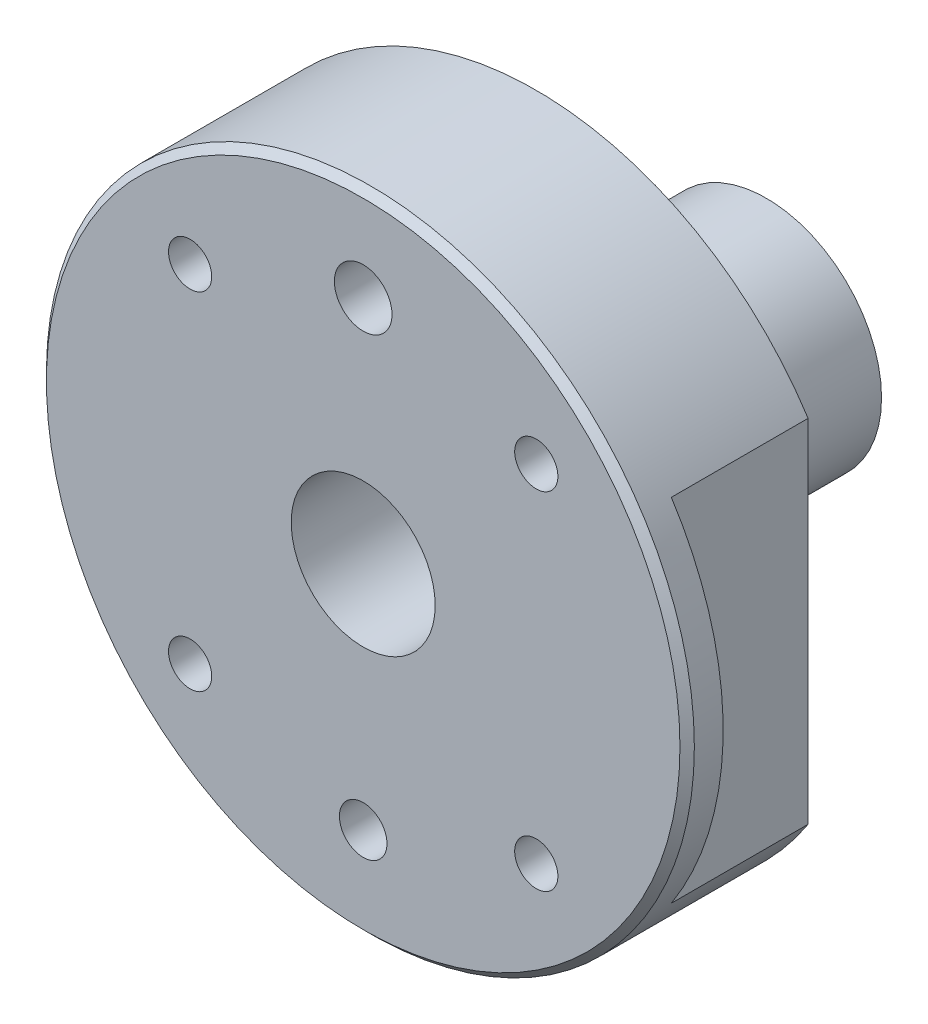
ISO-10303-21;
HEADER;
FILE_DESCRIPTION(('STEP AP214'),'2;1');
FILE_NAME('part.step','',(''),(''),'','','');
FILE_SCHEMA(('AUTOMOTIVE_DESIGN { 1 0 10303 214 1 1 1 1 }'));
ENDSEC;
DATA;
#1=APPLICATION_CONTEXT('core data for automotive mechanical design processes');
#2=APPLICATION_PROTOCOL_DEFINITION('international standard','automotive_design',2000,#1);
#3=PRODUCT_CONTEXT('',#1,'mechanical');
#4=PRODUCT('Part','Part','',(#3));
#5=PRODUCT_RELATED_PRODUCT_CATEGORY('part','',(#4));
#6=PRODUCT_DEFINITION_FORMATION('','',#4);
#7=PRODUCT_DEFINITION_CONTEXT('part definition',#1,'design');
#8=PRODUCT_DEFINITION('design','',#6,#7);
#9=PRODUCT_DEFINITION_SHAPE('','',#8);
#10=(LENGTH_UNIT() NAMED_UNIT(*) SI_UNIT(.MILLI.,.METRE.));
#11=(NAMED_UNIT(*) PLANE_ANGLE_UNIT() SI_UNIT($,.RADIAN.));
#12=(NAMED_UNIT(*) SI_UNIT($,.STERADIAN.) SOLID_ANGLE_UNIT());
#13=UNCERTAINTY_MEASURE_WITH_UNIT(LENGTH_MEASURE(1.E-05),#10,'distance_accuracy_value','');
#14=(GEOMETRIC_REPRESENTATION_CONTEXT(3) GLOBAL_UNCERTAINTY_ASSIGNED_CONTEXT((#13)) GLOBAL_UNIT_ASSIGNED_CONTEXT((#10,
#11,#12)) REPRESENTATION_CONTEXT('',''));
#15=CARTESIAN_POINT('',(0.,0.,0.));
#16=DIRECTION('',(0.,0.,1.));
#17=DIRECTION('',(1.,0.,0.));
#18=AXIS2_PLACEMENT_3D('',#15,#16,#17);
#19=CARTESIAN_POINT('',(0.,0.,0.));
#20=DIRECTION('',(0.,0.,1.));
#21=DIRECTION('',(1.,0.,0.));
#22=AXIS2_PLACEMENT_3D('',#19,#20,#21);
#23=PLANE('',#22);
#24=CARTESIAN_POINT('',(0.,16.,0.));
#25=DIRECTION('',(0.,0.,-1.));
#26=DIRECTION('',(-1.,0.,0.));
#27=AXIS2_PLACEMENT_3D('',#24,#25,#26);
#28=CIRCLE('',#27,2.);
#29=CARTESIAN_POINT('',(-2.,16.,0.));
#30=VERTEX_POINT('',#29);
#31=EDGE_CURVE('E126',#30,#30,#28,.T.);
#32=ORIENTED_EDGE('',*,*,#31,.F.);
#33=EDGE_LOOP('',(#32));
#34=FACE_BOUND('',#33,.T.);
#35=CARTESIAN_POINT('',(0.,-16.,0.));
#36=DIRECTION('',(0.,0.,-1.));
#37=DIRECTION('',(-1.,0.,0.));
#38=AXIS2_PLACEMENT_3D('',#35,#36,#37);
#39=CIRCLE('',#38,1.65);
#40=CARTESIAN_POINT('',(-1.65,-16.,0.));
#41=VERTEX_POINT('',#40);
#42=EDGE_CURVE('E132',#41,#41,#39,.T.);
#43=ORIENTED_EDGE('',*,*,#42,.F.);
#44=EDGE_LOOP('',(#43));
#45=FACE_BOUND('',#44,.T.);
#46=CARTESIAN_POINT('',(0.,0.,0.));
#47=DIRECTION('',(0.,0.,1.));
#48=DIRECTION('',(1.,0.,0.));
#49=AXIS2_PLACEMENT_3D('',#46,#47,#48);
#50=CIRCLE('',#49,8.);
#51=CARTESIAN_POINT('',(8.,0.,0.));
#52=VERTEX_POINT('',#51);
#53=EDGE_CURVE('E12',#52,#52,#50,.F.);
#54=ORIENTED_EDGE('',*,*,#53,.F.);
#55=EDGE_LOOP('',(#54));
#56=FACE_BOUND('',#55,.T.);
#57=DIRECTION('',(0.,1.,0.));
#58=VECTOR('',#57,1.);
#59=CARTESIAN_POINT('',(-18.9,-25.,0.));
#60=LINE('',#59,#58);
#61=CARTESIAN_POINT('',(-18.9,-12.2081939696255,0.));
#62=VERTEX_POINT('',#61);
#63=CARTESIAN_POINT('',(-18.9,12.2081939696255,0.));
#64=VERTEX_POINT('',#63);
#65=EDGE_CURVE('E60',#62,#64,#60,.T.);
#66=ORIENTED_EDGE('',*,*,#65,.T.);
#67=CARTESIAN_POINT('',(0.,0.,0.));
#68=DIRECTION('',(0.,0.,1.));
#69=DIRECTION('',(1.,0.,0.));
#70=AXIS2_PLACEMENT_3D('',#67,#68,#69);
#71=CIRCLE('',#70,22.5);
#72=CARTESIAN_POINT('',(18.9,12.2081939696255,0.));
#73=VERTEX_POINT('',#72);
#74=EDGE_CURVE('E100',#73,#64,#71,.T.);
#75=ORIENTED_EDGE('',*,*,#74,.F.);
#76=DIRECTION('',(0.,-1.,0.));
#77=VECTOR('',#76,1.);
#78=CARTESIAN_POINT('',(18.9,-25.,0.));
#79=LINE('',#78,#77);
#80=CARTESIAN_POINT('',(18.9,-12.2081939696255,0.));
#81=VERTEX_POINT('',#80);
#82=EDGE_CURVE('E68',#73,#81,#79,.T.);
#83=ORIENTED_EDGE('',*,*,#82,.T.);
#84=EDGE_CURVE('E98',#62,#81,#71,.T.);
#85=ORIENTED_EDGE('',*,*,#84,.F.);
#86=EDGE_LOOP('',(#66,#75,#83,#85));
#87=FACE_BOUND('',#86,.T.);
#88=ADVANCED_FACE('F42',(#34,#45,#56,#87),#23,.F.);
#89=CARTESIAN_POINT('',(0.,0.,12.));
#90=DIRECTION('',(0.,0.,-1.));
#91=DIRECTION('',(-1.,0.,0.));
#92=AXIS2_PLACEMENT_3D('',#89,#90,#91);
#93=CYLINDRICAL_SURFACE('',#92,22.5);
#94=CARTESIAN_POINT('',(0.,0.,11.5));
#95=DIRECTION('',(0.,0.,1.));
#96=DIRECTION('',(1.,0.,0.));
#97=AXIS2_PLACEMENT_3D('',#94,#95,#96);
#98=CIRCLE('',#97,22.5);
#99=CARTESIAN_POINT('',(22.5,0.,11.5));
#100=VERTEX_POINT('',#99);
#101=EDGE_CURVE('E116',#100,#100,#98,.F.);
#102=ORIENTED_EDGE('',*,*,#101,.T.);
#103=EDGE_LOOP('',(#102));
#104=FACE_BOUND('',#103,.T.);
#105=DIRECTION('',(0.,0.,-1.));
#106=VECTOR('',#105,1.);
#107=CARTESIAN_POINT('',(-18.9,12.2081939696255,12.));
#108=LINE('',#107,#106);
#109=CARTESIAN_POINT('',(-18.9,12.2081939696255,9.5));
#110=VERTEX_POINT('',#109);
#111=EDGE_CURVE('E52',#110,#64,#108,.T.);
#112=ORIENTED_EDGE('',*,*,#111,.F.);
#113=CARTESIAN_POINT('',(0.,0.,9.5));
#114=DIRECTION('',(0.,0.,-1.));
#115=DIRECTION('',(-1.,0.,0.));
#116=AXIS2_PLACEMENT_3D('',#113,#114,#115);
#117=CIRCLE('',#116,22.5);
#118=CARTESIAN_POINT('',(-18.9,-12.2081939696255,9.5));
#119=VERTEX_POINT('',#118);
#120=EDGE_CURVE('E121',#119,#110,#117,.T.);
#121=ORIENTED_EDGE('',*,*,#120,.F.);
#122=DIRECTION('',(0.,0.,-1.));
#123=VECTOR('',#122,1.);
#124=CARTESIAN_POINT('',(-18.9,-12.2081939696255,12.));
#125=LINE('',#124,#123);
#126=EDGE_CURVE('E92',#62,#119,#125,.F.);
#127=ORIENTED_EDGE('',*,*,#126,.F.);
#128=ORIENTED_EDGE('',*,*,#84,.T.);
#129=DIRECTION('',(0.,0.,-1.));
#130=VECTOR('',#129,1.);
#131=CARTESIAN_POINT('',(18.9,-12.2081939696255,12.));
#132=LINE('',#131,#130);
#133=CARTESIAN_POINT('',(18.9,-12.2081939696255,9.5));
#134=VERTEX_POINT('',#133);
#135=EDGE_CURVE('E85',#134,#81,#132,.T.);
#136=ORIENTED_EDGE('',*,*,#135,.F.);
#137=CARTESIAN_POINT('',(18.9,12.2081939696255,9.5));
#138=VERTEX_POINT('',#137);
#139=EDGE_CURVE('E93',#138,#134,#117,.T.);
#140=ORIENTED_EDGE('',*,*,#139,.F.);
#141=DIRECTION('',(0.,0.,-1.));
#142=VECTOR('',#141,1.);
#143=CARTESIAN_POINT('',(18.9,12.2081939696255,12.));
#144=LINE('',#143,#142);
#145=EDGE_CURVE('E119',#73,#138,#144,.F.);
#146=ORIENTED_EDGE('',*,*,#145,.F.);
#147=ORIENTED_EDGE('',*,*,#74,.T.);
#148=EDGE_LOOP('',(#112,#121,#127,#128,#136,#140,#146,#147));
#149=FACE_BOUND('',#148,.T.);
#150=ADVANCED_FACE('F104',(#104,#149),#93,.T.);
#151=CARTESIAN_POINT('',(0.,0.,12.));
#152=DIRECTION('',(0.,0.,1.));
#153=DIRECTION('',(1.,0.,0.));
#154=AXIS2_PLACEMENT_3D('',#151,#152,#153);
#155=PLANE('',#154);
#156=CARTESIAN_POINT('',(0.,16.,12.));
#157=DIRECTION('',(0.,0.,1.));
#158=DIRECTION('',(1.,0.,0.));
#159=AXIS2_PLACEMENT_3D('',#156,#157,#158);
#160=CIRCLE('',#159,2.);
#161=CARTESIAN_POINT('',(2.,16.,12.));
#162=VERTEX_POINT('',#161);
#163=EDGE_CURVE('E47',#162,#162,#160,.T.);
#164=ORIENTED_EDGE('',*,*,#163,.F.);
#165=EDGE_LOOP('',(#164));
#166=FACE_BOUND('',#165,.T.);
#167=CARTESIAN_POINT('',(0.,-16.,12.));
#168=DIRECTION('',(0.,0.,1.));
#169=DIRECTION('',(1.,0.,0.));
#170=AXIS2_PLACEMENT_3D('',#167,#168,#169);
#171=CIRCLE('',#170,1.65);
#172=CARTESIAN_POINT('',(1.65,-16.,12.));
#173=VERTEX_POINT('',#172);
#174=EDGE_CURVE('E124',#173,#173,#171,.T.);
#175=ORIENTED_EDGE('',*,*,#174,.F.);
#176=EDGE_LOOP('',(#175));
#177=FACE_BOUND('',#176,.T.);
#178=CARTESIAN_POINT('',(0.,0.,12.));
#179=DIRECTION('',(0.,0.,1.));
#180=DIRECTION('',(1.,0.,0.));
#181=AXIS2_PLACEMENT_3D('',#178,#179,#180);
#182=CIRCLE('',#181,22.);
#183=CARTESIAN_POINT('',(22.,0.,12.));
#184=VERTEX_POINT('',#183);
#185=EDGE_CURVE('E108',#184,#184,#182,.T.);
#186=ORIENTED_EDGE('',*,*,#185,.T.);
#187=EDGE_LOOP('',(#186));
#188=FACE_BOUND('',#187,.T.);
#189=CARTESIAN_POINT('',(-12.0208152801713,12.0208152801713,12.));
#190=DIRECTION('',(0.,0.,1.));
#191=DIRECTION('',(1.,0.,0.));
#192=AXIS2_PLACEMENT_3D('',#189,#190,#191);
#193=CIRCLE('',#192,1.5);
#194=CARTESIAN_POINT('',(-10.5208152801713,12.0208152801713,12.));
#195=VERTEX_POINT('',#194);
#196=EDGE_CURVE('E158',#195,#195,#193,.T.);
#197=ORIENTED_EDGE('',*,*,#196,.F.);
#198=EDGE_LOOP('',(#197));
#199=FACE_BOUND('',#198,.T.);
#200=CARTESIAN_POINT('',(12.0208152801713,-12.0208152801713,12.));
#201=DIRECTION('',(0.,0.,1.));
#202=DIRECTION('',(1.,0.,0.));
#203=AXIS2_PLACEMENT_3D('',#200,#201,#202);
#204=CIRCLE('',#203,1.5);
#205=CARTESIAN_POINT('',(13.5208152801713,-12.0208152801713,12.));
#206=VERTEX_POINT('',#205);
#207=EDGE_CURVE('E165',#206,#206,#204,.T.);
#208=ORIENTED_EDGE('',*,*,#207,.F.);
#209=EDGE_LOOP('',(#208));
#210=FACE_BOUND('',#209,.T.);
#211=CARTESIAN_POINT('',(-12.0208152801713,-12.0208152801713,12.));
#212=DIRECTION('',(0.,0.,1.));
#213=DIRECTION('',(1.,0.,0.));
#214=AXIS2_PLACEMENT_3D('',#211,#212,#213);
#215=CIRCLE('',#214,1.5);
#216=CARTESIAN_POINT('',(-10.5208152801713,-12.0208152801713,12.));
#217=VERTEX_POINT('',#216);
#218=EDGE_CURVE('E152',#217,#217,#215,.T.);
#219=ORIENTED_EDGE('',*,*,#218,.F.);
#220=EDGE_LOOP('',(#219));
#221=FACE_BOUND('',#220,.T.);
#222=CARTESIAN_POINT('',(12.0208152801713,12.0208152801713,12.));
#223=DIRECTION('',(0.,0.,1.));
#224=DIRECTION('',(1.,0.,0.));
#225=AXIS2_PLACEMENT_3D('',#222,#223,#224);
#226=CIRCLE('',#225,1.5);
#227=CARTESIAN_POINT('',(13.5208152801713,12.0208152801713,12.));
#228=VERTEX_POINT('',#227);
#229=EDGE_CURVE('E161',#228,#228,#226,.T.);
#230=ORIENTED_EDGE('',*,*,#229,.F.);
#231=EDGE_LOOP('',(#230));
#232=FACE_BOUND('',#231,.T.);
#233=CARTESIAN_POINT('',(0.,0.,12.));
#234=DIRECTION('',(0.,0.,1.));
#235=DIRECTION('',(1.,0.,0.));
#236=AXIS2_PLACEMENT_3D('',#233,#234,#235);
#237=CIRCLE('',#236,5.);
#238=CARTESIAN_POINT('',(5.,0.,12.));
#239=VERTEX_POINT('',#238);
#240=EDGE_CURVE('E106',#239,#239,#237,.T.);
#241=ORIENTED_EDGE('',*,*,#240,.F.);
#242=EDGE_LOOP('',(#241));
#243=FACE_BOUND('',#242,.T.);
#244=ADVANCED_FACE('F178',(#166,#177,#188,#199,#210,#221,#232,#243),#155,.T.);
#245=CARTESIAN_POINT('',(0.,0.,12.));
#246=DIRECTION('',(0.,0.,-1.));
#247=DIRECTION('',(-1.,0.,0.));
#248=AXIS2_PLACEMENT_3D('',#245,#246,#247);
#249=CYLINDRICAL_SURFACE('',#248,5.);
#250=ORIENTED_EDGE('',*,*,#240,.T.);
#251=EDGE_LOOP('',(#250));
#252=FACE_BOUND('',#251,.T.);
#253=CARTESIAN_POINT('',(0.,0.,0.));
#254=DIRECTION('',(0.,0.,1.));
#255=DIRECTION('',(1.,0.,0.));
#256=AXIS2_PLACEMENT_3D('',#253,#254,#255);
#257=CIRCLE('',#256,5.);
#258=CARTESIAN_POINT('',(5.,0.,0.));
#259=VERTEX_POINT('',#258);
#260=EDGE_CURVE('E110',#259,#259,#257,.T.);
#261=ORIENTED_EDGE('',*,*,#260,.F.);
#262=EDGE_LOOP('',(#261));
#263=FACE_BOUND('',#262,.T.);
#264=ADVANCED_FACE('F181',(#252,#263),#249,.F.);
#265=CARTESIAN_POINT('',(12.0208152801713,12.0208152801713,6.5));
#266=DIRECTION('',(0.,0.,1.));
#267=DIRECTION('',(1.,0.,0.));
#268=AXIS2_PLACEMENT_3D('',#265,#266,#267);
#269=CYLINDRICAL_SURFACE('',#268,1.5);
#270=CARTESIAN_POINT('',(12.0208152801713,12.0208152801713,6.5));
#271=DIRECTION('',(0.,0.,1.));
#272=DIRECTION('',(1.,0.,0.));
#273=AXIS2_PLACEMENT_3D('',#270,#271,#272);
#274=CIRCLE('',#273,1.5);
#275=CARTESIAN_POINT('',(13.5208152801713,12.0208152801713,6.5));
#276=VERTEX_POINT('',#275);
#277=EDGE_CURVE('E170',#276,#276,#274,.T.);
#278=ORIENTED_EDGE('',*,*,#277,.F.);
#279=EDGE_LOOP('',(#278));
#280=FACE_BOUND('',#279,.T.);
#281=ORIENTED_EDGE('',*,*,#229,.T.);
#282=EDGE_LOOP('',(#281));
#283=FACE_BOUND('',#282,.T.);
#284=ADVANCED_FACE('F176',(#280,#283),#269,.F.);
#285=CARTESIAN_POINT('',(12.0208152801713,12.0208152801713,6.5));
#286=DIRECTION('',(0.,0.,1.));
#287=DIRECTION('',(1.,0.,0.));
#288=AXIS2_PLACEMENT_3D('',#285,#286,#287);
#289=PLANE('',#288);
#290=ORIENTED_EDGE('',*,*,#277,.T.);
#291=EDGE_LOOP('',(#290));
#292=FACE_BOUND('',#291,.T.);
#293=ADVANCED_FACE('F220',(#292),#289,.T.);
#294=CARTESIAN_POINT('',(-12.0208152801713,-12.0208152801713,6.5));
#295=DIRECTION('',(0.,0.,1.));
#296=DIRECTION('',(1.,0.,0.));
#297=AXIS2_PLACEMENT_3D('',#294,#295,#296);
#298=CYLINDRICAL_SURFACE('',#297,1.5);
#299=CARTESIAN_POINT('',(-12.0208152801713,-12.0208152801713,6.5));
#300=DIRECTION('',(0.,0.,1.));
#301=DIRECTION('',(1.,0.,0.));
#302=AXIS2_PLACEMENT_3D('',#299,#300,#301);
#303=CIRCLE('',#302,1.5);
#304=CARTESIAN_POINT('',(-10.5208152801713,-12.0208152801713,6.5));
#305=VERTEX_POINT('',#304);
#306=EDGE_CURVE('E150',#305,#305,#303,.T.);
#307=ORIENTED_EDGE('',*,*,#306,.F.);
#308=EDGE_LOOP('',(#307));
#309=FACE_BOUND('',#308,.T.);
#310=ORIENTED_EDGE('',*,*,#218,.T.);
#311=EDGE_LOOP('',(#310));
#312=FACE_BOUND('',#311,.T.);
#313=ADVANCED_FACE('F224',(#309,#312),#298,.F.);
#314=CARTESIAN_POINT('',(-12.0208152801713,-12.0208152801713,6.5));
#315=DIRECTION('',(0.,0.,1.));
#316=DIRECTION('',(1.,0.,0.));
#317=AXIS2_PLACEMENT_3D('',#314,#315,#316);
#318=PLANE('',#317);
#319=ORIENTED_EDGE('',*,*,#306,.T.);
#320=EDGE_LOOP('',(#319));
#321=FACE_BOUND('',#320,.T.);
#322=ADVANCED_FACE('F234',(#321),#318,.T.);
#323=CARTESIAN_POINT('',(12.0208152801713,-12.0208152801713,6.5));
#324=DIRECTION('',(0.,0.,1.));
#325=DIRECTION('',(1.,0.,0.));
#326=AXIS2_PLACEMENT_3D('',#323,#324,#325);
#327=CYLINDRICAL_SURFACE('',#326,1.5);
#328=CARTESIAN_POINT('',(12.0208152801713,-12.0208152801713,6.5));
#329=DIRECTION('',(0.,0.,1.));
#330=DIRECTION('',(1.,0.,0.));
#331=AXIS2_PLACEMENT_3D('',#328,#329,#330);
#332=CIRCLE('',#331,1.5);
#333=CARTESIAN_POINT('',(13.5208152801713,-12.0208152801713,6.5));
#334=VERTEX_POINT('',#333);
#335=EDGE_CURVE('E155',#334,#334,#332,.T.);
#336=ORIENTED_EDGE('',*,*,#335,.F.);
#337=EDGE_LOOP('',(#336));
#338=FACE_BOUND('',#337,.T.);
#339=ORIENTED_EDGE('',*,*,#207,.T.);
#340=EDGE_LOOP('',(#339));
#341=FACE_BOUND('',#340,.T.);
#342=ADVANCED_FACE('F230',(#338,#341),#327,.F.);
#343=CARTESIAN_POINT('',(12.0208152801713,-12.0208152801713,6.5));
#344=DIRECTION('',(0.,0.,1.));
#345=DIRECTION('',(1.,0.,0.));
#346=AXIS2_PLACEMENT_3D('',#343,#344,#345);
#347=PLANE('',#346);
#348=ORIENTED_EDGE('',*,*,#335,.T.);
#349=EDGE_LOOP('',(#348));
#350=FACE_BOUND('',#349,.T.);
#351=ADVANCED_FACE('F226',(#350),#347,.T.);
#352=CARTESIAN_POINT('',(-12.0208152801713,12.0208152801713,6.5));
#353=DIRECTION('',(0.,0.,1.));
#354=DIRECTION('',(1.,0.,0.));
#355=AXIS2_PLACEMENT_3D('',#352,#353,#354);
#356=CYLINDRICAL_SURFACE('',#355,1.5);
#357=CARTESIAN_POINT('',(-12.0208152801713,12.0208152801713,6.5));
#358=DIRECTION('',(0.,0.,1.));
#359=DIRECTION('',(1.,0.,0.));
#360=AXIS2_PLACEMENT_3D('',#357,#358,#359);
#361=CIRCLE('',#360,1.5);
#362=CARTESIAN_POINT('',(-10.5208152801713,12.0208152801713,6.5));
#363=VERTEX_POINT('',#362);
#364=EDGE_CURVE('E162',#363,#363,#361,.T.);
#365=ORIENTED_EDGE('',*,*,#364,.F.);
#366=EDGE_LOOP('',(#365));
#367=FACE_BOUND('',#366,.T.);
#368=ORIENTED_EDGE('',*,*,#196,.T.);
#369=EDGE_LOOP('',(#368));
#370=FACE_BOUND('',#369,.T.);
#371=ADVANCED_FACE('F229',(#367,#370),#356,.F.);
#372=CARTESIAN_POINT('',(-12.0208152801713,12.0208152801713,6.5));
#373=DIRECTION('',(0.,0.,1.));
#374=DIRECTION('',(1.,0.,0.));
#375=AXIS2_PLACEMENT_3D('',#372,#373,#374);
#376=PLANE('',#375);
#377=ORIENTED_EDGE('',*,*,#364,.T.);
#378=EDGE_LOOP('',(#377));
#379=FACE_BOUND('',#378,.T.);
#380=ADVANCED_FACE('F236',(#379),#376,.T.);
#381=CARTESIAN_POINT('',(0.,0.,12.));
#382=DIRECTION('',(0.,0.,-1.));
#383=DIRECTION('',(-1.,0.,0.));
#384=AXIS2_PLACEMENT_3D('',#381,#382,#383);
#385=CONICAL_SURFACE('',#384,22.,0.785398163397441);
#386=ORIENTED_EDGE('',*,*,#101,.F.);
#387=EDGE_LOOP('',(#386));
#388=FACE_BOUND('',#387,.T.);
#389=ORIENTED_EDGE('',*,*,#185,.F.);
#390=EDGE_LOOP('',(#389));
#391=FACE_BOUND('',#390,.T.);
#392=ADVANCED_FACE('F45',(#388,#391),#385,.T.);
#393=CARTESIAN_POINT('',(18.9,-25.,9.5));
#394=DIRECTION('',(1.,0.,0.));
#395=DIRECTION('',(0.,0.,-1.));
#396=AXIS2_PLACEMENT_3D('',#393,#394,#395);
#397=PLANE('',#396);
#398=ORIENTED_EDGE('',*,*,#135,.T.);
#399=ORIENTED_EDGE('',*,*,#82,.F.);
#400=ORIENTED_EDGE('',*,*,#145,.T.);
#401=DIRECTION('',(0.,-1.,0.));
#402=VECTOR('',#401,1.);
#403=CARTESIAN_POINT('',(18.9,-25.,9.5));
#404=LINE('',#403,#402);
#405=EDGE_CURVE('E88',#138,#134,#404,.T.);
#406=ORIENTED_EDGE('',*,*,#405,.T.);
#407=EDGE_LOOP('',(#398,#399,#400,#406));
#408=FACE_BOUND('',#407,.T.);
#409=ADVANCED_FACE('F86',(#408),#397,.T.);
#410=CARTESIAN_POINT('',(0.,0.,9.5));
#411=DIRECTION('',(0.,0.,-1.));
#412=DIRECTION('',(-1.,0.,0.));
#413=AXIS2_PLACEMENT_3D('',#410,#411,#412);
#414=PLANE('',#413);
#415=ORIENTED_EDGE('',*,*,#139,.T.);
#416=ORIENTED_EDGE('',*,*,#405,.F.);
#417=EDGE_LOOP('',(#415,#416));
#418=FACE_BOUND('',#417,.T.);
#419=ADVANCED_FACE('F249',(#418),#414,.T.);
#420=ORIENTED_EDGE('',*,*,#120,.T.);
#421=DIRECTION('',(0.,1.,0.));
#422=VECTOR('',#421,1.);
#423=CARTESIAN_POINT('',(-18.9,-25.,9.5));
#424=LINE('',#423,#422);
#425=EDGE_CURVE('E101',#119,#110,#424,.T.);
#426=ORIENTED_EDGE('',*,*,#425,.F.);
#427=EDGE_LOOP('',(#420,#426));
#428=FACE_BOUND('',#427,.T.);
#429=ADVANCED_FACE('F205',(#428),#414,.T.);
#430=CARTESIAN_POINT('',(-18.9,-25.,9.5));
#431=DIRECTION('',(-1.,0.,0.));
#432=DIRECTION('',(0.,0.,1.));
#433=AXIS2_PLACEMENT_3D('',#430,#431,#432);
#434=PLANE('',#433);
#435=ORIENTED_EDGE('',*,*,#111,.T.);
#436=ORIENTED_EDGE('',*,*,#65,.F.);
#437=ORIENTED_EDGE('',*,*,#126,.T.);
#438=ORIENTED_EDGE('',*,*,#425,.T.);
#439=EDGE_LOOP('',(#435,#436,#437,#438));
#440=FACE_BOUND('',#439,.T.);
#441=ADVANCED_FACE('F195',(#440),#434,.T.);
#442=CARTESIAN_POINT('',(0.,0.,0.));
#443=DIRECTION('',(0.,0.,-1.));
#444=DIRECTION('',(-1.,0.,0.));
#445=AXIS2_PLACEMENT_3D('',#442,#443,#444);
#446=PLANE('',#445);
#447=CARTESIAN_POINT('',(0.,0.,0.));
#448=DIRECTION('',(0.,0.,-1.));
#449=DIRECTION('',(-1.,0.,0.));
#450=AXIS2_PLACEMENT_3D('',#447,#448,#449);
#451=CIRCLE('',#450,4.);
#452=CARTESIAN_POINT('',(-4.,0.,0.));
#453=VERTEX_POINT('',#452);
#454=EDGE_CURVE('E130',#453,#453,#451,.T.);
#455=ORIENTED_EDGE('',*,*,#454,.T.);
#456=EDGE_LOOP('',(#455));
#457=FACE_BOUND('',#456,.T.);
#458=ORIENTED_EDGE('',*,*,#260,.T.);
#459=EDGE_LOOP('',(#458));
#460=FACE_BOUND('',#459,.T.);
#461=ADVANCED_FACE('F192',(#457,#460),#446,.F.);
#462=CARTESIAN_POINT('',(0.,0.,-16.));
#463=DIRECTION('',(0.,0.,-1.));
#464=DIRECTION('',(-1.,0.,0.));
#465=AXIS2_PLACEMENT_3D('',#462,#463,#464);
#466=PLANE('',#465);
#467=CARTESIAN_POINT('',(0.,0.,-16.));
#468=DIRECTION('',(0.,0.,-1.));
#469=DIRECTION('',(-1.,0.,0.));
#470=AXIS2_PLACEMENT_3D('',#467,#468,#469);
#471=CIRCLE('',#470,8.);
#472=CARTESIAN_POINT('',(-8.,0.,-16.));
#473=VERTEX_POINT('',#472);
#474=EDGE_CURVE('E142',#473,#473,#471,.T.);
#475=ORIENTED_EDGE('',*,*,#474,.T.);
#476=EDGE_LOOP('',(#475));
#477=FACE_BOUND('',#476,.T.);
#478=CARTESIAN_POINT('',(0.,0.,-16.));
#479=DIRECTION('',(0.,0.,-1.));
#480=DIRECTION('',(-1.,0.,0.));
#481=AXIS2_PLACEMENT_3D('',#478,#479,#480);
#482=CIRCLE('',#481,4.);
#483=CARTESIAN_POINT('',(-4.,0.,-16.));
#484=VERTEX_POINT('',#483);
#485=EDGE_CURVE('E139',#484,#484,#482,.T.);
#486=ORIENTED_EDGE('',*,*,#485,.F.);
#487=EDGE_LOOP('',(#486));
#488=FACE_BOUND('',#487,.T.);
#489=ADVANCED_FACE('F194',(#477,#488),#466,.T.);
#490=CARTESIAN_POINT('',(0.,0.,-16.));
#491=DIRECTION('',(0.,0.,1.));
#492=DIRECTION('',(1.,0.,0.));
#493=AXIS2_PLACEMENT_3D('',#490,#491,#492);
#494=CYLINDRICAL_SURFACE('',#493,8.);
#495=ORIENTED_EDGE('',*,*,#474,.F.);
#496=EDGE_LOOP('',(#495));
#497=FACE_BOUND('',#496,.T.);
#498=ORIENTED_EDGE('',*,*,#53,.T.);
#499=EDGE_LOOP('',(#498));
#500=FACE_BOUND('',#499,.T.);
#501=ADVANCED_FACE('F202',(#497,#500),#494,.T.);
#502=CARTESIAN_POINT('',(0.,0.,-16.));
#503=DIRECTION('',(0.,0.,1.));
#504=DIRECTION('',(1.,0.,0.));
#505=AXIS2_PLACEMENT_3D('',#502,#503,#504);
#506=CYLINDRICAL_SURFACE('',#505,4.);
#507=ORIENTED_EDGE('',*,*,#485,.T.);
#508=EDGE_LOOP('',(#507));
#509=FACE_BOUND('',#508,.T.);
#510=ORIENTED_EDGE('',*,*,#454,.F.);
#511=EDGE_LOOP('',(#510));
#512=FACE_BOUND('',#511,.T.);
#513=ADVANCED_FACE('F255',(#509,#512),#506,.F.);
#514=CARTESIAN_POINT('',(0.,-16.,16.5));
#515=DIRECTION('',(0.,0.,-1.));
#516=DIRECTION('',(-1.,0.,0.));
#517=AXIS2_PLACEMENT_3D('',#514,#515,#516);
#518=CYLINDRICAL_SURFACE('',#517,1.65);
#519=ORIENTED_EDGE('',*,*,#174,.T.);
#520=EDGE_LOOP('',(#519));
#521=FACE_BOUND('',#520,.T.);
#522=ORIENTED_EDGE('',*,*,#42,.T.);
#523=EDGE_LOOP('',(#522));
#524=FACE_BOUND('',#523,.T.);
#525=ADVANCED_FACE('F259',(#521,#524),#518,.F.);
#526=CARTESIAN_POINT('',(0.,16.,16.5));
#527=DIRECTION('',(0.,0.,-1.));
#528=DIRECTION('',(-1.,0.,0.));
#529=AXIS2_PLACEMENT_3D('',#526,#527,#528);
#530=CYLINDRICAL_SURFACE('',#529,2.);
#531=ORIENTED_EDGE('',*,*,#163,.T.);
#532=EDGE_LOOP('',(#531));
#533=FACE_BOUND('',#532,.T.);
#534=ORIENTED_EDGE('',*,*,#31,.T.);
#535=EDGE_LOOP('',(#534));
#536=FACE_BOUND('',#535,.T.);
#537=ADVANCED_FACE('F273',(#533,#536),#530,.F.);
#538=CLOSED_SHELL('',(#88,#150,#244,#264,#284,#293,#313,#322,#342,#351,#371,#380,#392,#409,#419,
#429,#441,#461,#489,#501,#513,#525,#537));
#539=MANIFOLD_SOLID_BREP('B2',#538);
#540=ADVANCED_BREP_SHAPE_REPRESENTATION('',(#18,#539),#14);
#541=SHAPE_DEFINITION_REPRESENTATION(#9,#540);
ENDSEC;
END-ISO-10303-21;
